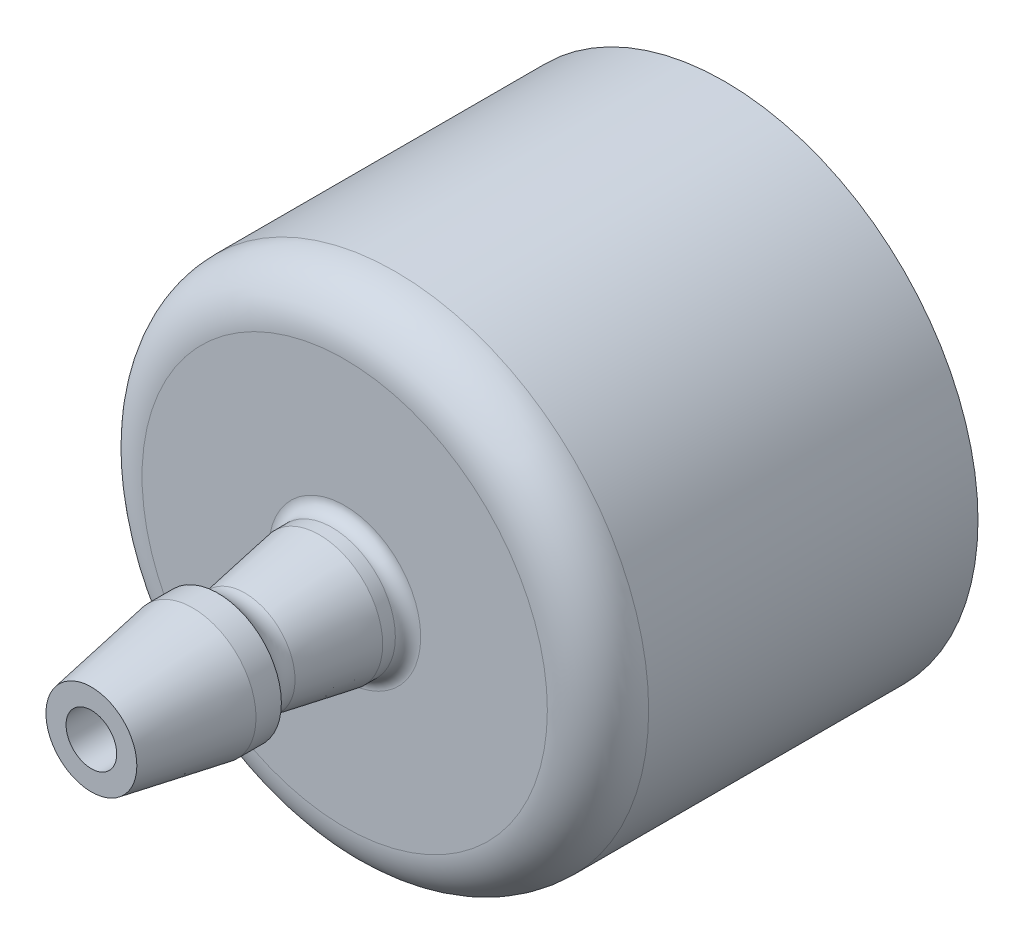
ISO-10303-21;
HEADER;
FILE_DESCRIPTION(('STEP AP214'),'2;1');
FILE_NAME('part.step','',(''),(''),'','','');
FILE_SCHEMA(('AUTOMOTIVE_DESIGN { 1 0 10303 214 1 1 1 1 }'));
ENDSEC;
DATA;
#1=APPLICATION_CONTEXT('core data for automotive mechanical design processes');
#2=APPLICATION_PROTOCOL_DEFINITION('international standard','automotive_design',2000,#1);
#3=PRODUCT_CONTEXT('',#1,'mechanical');
#4=PRODUCT('Part','Part','',(#3));
#5=PRODUCT_RELATED_PRODUCT_CATEGORY('part','',(#4));
#6=PRODUCT_DEFINITION_FORMATION('','',#4);
#7=PRODUCT_DEFINITION_CONTEXT('part definition',#1,'design');
#8=PRODUCT_DEFINITION('design','',#6,#7);
#9=PRODUCT_DEFINITION_SHAPE('','',#8);
#10=(LENGTH_UNIT() NAMED_UNIT(*) SI_UNIT(.MILLI.,.METRE.));
#11=(NAMED_UNIT(*) PLANE_ANGLE_UNIT() SI_UNIT($,.RADIAN.));
#12=(NAMED_UNIT(*) SI_UNIT($,.STERADIAN.) SOLID_ANGLE_UNIT());
#13=UNCERTAINTY_MEASURE_WITH_UNIT(LENGTH_MEASURE(1.E-05),#10,'distance_accuracy_value','');
#14=(GEOMETRIC_REPRESENTATION_CONTEXT(3) GLOBAL_UNCERTAINTY_ASSIGNED_CONTEXT((#13)) GLOBAL_UNIT_ASSIGNED_CONTEXT((#10,
#11,#12)) REPRESENTATION_CONTEXT('',''));
#15=CARTESIAN_POINT('',(0.,0.,0.));
#16=DIRECTION('',(0.,0.,1.));
#17=DIRECTION('',(1.,0.,0.));
#18=AXIS2_PLACEMENT_3D('',#15,#16,#17);
#19=CARTESIAN_POINT('',(0.,0.,5.));
#20=DIRECTION('',(0.,0.,-1.));
#21=DIRECTION('',(-1.,0.,0.));
#22=AXIS2_PLACEMENT_3D('',#19,#20,#21);
#23=CYLINDRICAL_SURFACE('',#22,2.5);
#24=CARTESIAN_POINT('',(0.,0.,0.5));
#25=DIRECTION('',(0.,0.,1.));
#26=DIRECTION('',(1.,0.,0.));
#27=AXIS2_PLACEMENT_3D('',#24,#25,#26);
#28=CIRCLE('',#27,2.5);
#29=CARTESIAN_POINT('',(2.5,0.,0.5));
#30=VERTEX_POINT('',#29);
#31=EDGE_CURVE('E45',#30,#30,#28,.T.);
#32=ORIENTED_EDGE('',*,*,#31,.T.);
#33=EDGE_LOOP('',(#32));
#34=FACE_BOUND('',#33,.T.);
#35=CARTESIAN_POINT('',(0.,0.,0.999999999999935));
#36=DIRECTION('',(0.,0.,1.));
#37=DIRECTION('',(1.,0.,0.));
#38=AXIS2_PLACEMENT_3D('',#35,#36,#37);
#39=CIRCLE('',#38,2.5);
#40=CARTESIAN_POINT('',(2.5,0.,0.999999999999935));
#41=VERTEX_POINT('',#40);
#42=EDGE_CURVE('E71',#41,#41,#39,.F.);
#43=ORIENTED_EDGE('',*,*,#42,.T.);
#44=EDGE_LOOP('',(#43));
#45=FACE_BOUND('',#44,.T.);
#46=ADVANCED_FACE('F30',(#34,#45),#23,.T.);
#47=CARTESIAN_POINT('',(0.,0.,5.));
#48=DIRECTION('',(0.,0.,-1.));
#49=DIRECTION('',(-1.,0.,0.));
#50=AXIS2_PLACEMENT_3D('',#47,#48,#49);
#51=CYLINDRICAL_SURFACE('',#50,1.);
#52=CARTESIAN_POINT('',(0.,0.,0.));
#53=DIRECTION('',(0.,0.,1.));
#54=DIRECTION('',(1.,0.,0.));
#55=AXIS2_PLACEMENT_3D('',#52,#53,#54);
#56=CIRCLE('',#55,1.);
#57=CARTESIAN_POINT('',(1.,0.,0.));
#58=VERTEX_POINT('',#57);
#59=EDGE_CURVE('E56',#58,#58,#56,.F.);
#60=ORIENTED_EDGE('',*,*,#59,.T.);
#61=EDGE_LOOP('',(#60));
#62=FACE_BOUND('',#61,.T.);
#63=CARTESIAN_POINT('',(0.,0.,10.));
#64=DIRECTION('',(0.,0.,1.));
#65=DIRECTION('',(1.,0.,0.));
#66=AXIS2_PLACEMENT_3D('',#63,#64,#65);
#67=CIRCLE('',#66,1.);
#68=CARTESIAN_POINT('',(1.,0.,10.));
#69=VERTEX_POINT('',#68);
#70=EDGE_CURVE('E77',#69,#69,#67,.T.);
#71=ORIENTED_EDGE('',*,*,#70,.T.);
#72=EDGE_LOOP('',(#71));
#73=FACE_BOUND('',#72,.T.);
#74=ADVANCED_FACE('F105',(#62,#73),#51,.F.);
#75=CARTESIAN_POINT('',(0.,0.,5.));
#76=DIRECTION('',(0.,0.,-1.));
#77=DIRECTION('',(-1.,0.,0.));
#78=AXIS2_PLACEMENT_3D('',#75,#76,#77);
#79=CONICAL_SURFACE('',#78,1.79469207716614,0.17453292519943);
#80=CARTESIAN_POINT('',(0.,0.,3.94162981419659));
#81=DIRECTION('',(0.,0.,-1.));
#82=DIRECTION('',(-1.,0.,0.));
#83=AXIS2_PLACEMENT_3D('',#80,#81,#82);
#84=CIRCLE('',#83,1.98131129650071);
#85=CARTESIAN_POINT('',(-1.98131129650071,0.,3.94162981419659));
#86=VERTEX_POINT('',#85);
#87=EDGE_CURVE('E62',#86,#86,#84,.T.);
#88=ORIENTED_EDGE('',*,*,#87,.T.);
#89=EDGE_LOOP('',(#88));
#90=FACE_BOUND('',#89,.T.);
#91=ORIENTED_EDGE('',*,*,#42,.F.);
#92=EDGE_LOOP('',(#91));
#93=FACE_BOUND('',#92,.T.);
#94=ADVANCED_FACE('F113',(#90,#93),#79,.T.);
#95=CARTESIAN_POINT('',(0.,0.,10.));
#96=DIRECTION('',(0.,0.,1.));
#97=DIRECTION('',(1.,0.,0.));
#98=AXIS2_PLACEMENT_3D('',#95,#96,#97);
#99=PLANE('',#98);
#100=CARTESIAN_POINT('',(0.,0.,10.));
#101=DIRECTION('',(0.,0.,1.));
#102=DIRECTION('',(1.,0.,0.));
#103=AXIS2_PLACEMENT_3D('',#100,#101,#102);
#104=CIRCLE('',#103,1.79469207716614);
#105=CARTESIAN_POINT('',(1.79469207716614,0.,10.));
#106=VERTEX_POINT('',#105);
#107=EDGE_CURVE('E68',#106,#106,#104,.T.);
#108=ORIENTED_EDGE('',*,*,#107,.T.);
#109=EDGE_LOOP('',(#108));
#110=FACE_BOUND('',#109,.T.);
#111=ORIENTED_EDGE('',*,*,#70,.F.);
#112=EDGE_LOOP('',(#111));
#113=FACE_BOUND('',#112,.T.);
#114=ADVANCED_FACE('F121',(#110,#113),#99,.T.);
#115=CARTESIAN_POINT('',(0.,0.,10.));
#116=DIRECTION('',(0.,0.,-1.));
#117=DIRECTION('',(-1.,0.,0.));
#118=AXIS2_PLACEMENT_3D('',#115,#116,#117);
#119=CYLINDRICAL_SURFACE('',#118,2.5);
#120=CARTESIAN_POINT('',(0.,0.,5.99999999999994));
#121=DIRECTION('',(0.,0.,1.));
#122=DIRECTION('',(1.,0.,0.));
#123=AXIS2_PLACEMENT_3D('',#120,#121,#122);
#124=CIRCLE('',#123,2.5);
#125=CARTESIAN_POINT('',(2.5,0.,5.99999999999994));
#126=VERTEX_POINT('',#125);
#127=EDGE_CURVE('E65',#126,#126,#124,.F.);
#128=ORIENTED_EDGE('',*,*,#127,.T.);
#129=EDGE_LOOP('',(#128));
#130=FACE_BOUND('',#129,.T.);
#131=CARTESIAN_POINT('',(0.,0.,5.));
#132=DIRECTION('',(0.,0.,1.));
#133=DIRECTION('',(1.,0.,0.));
#134=AXIS2_PLACEMENT_3D('',#131,#132,#133);
#135=CIRCLE('',#134,2.5);
#136=CARTESIAN_POINT('',(2.5,0.,5.));
#137=VERTEX_POINT('',#136);
#138=EDGE_CURVE('E74',#137,#137,#135,.T.);
#139=ORIENTED_EDGE('',*,*,#138,.T.);
#140=EDGE_LOOP('',(#139));
#141=FACE_BOUND('',#140,.T.);
#142=ADVANCED_FACE('F127',(#130,#141),#119,.T.);
#143=CARTESIAN_POINT('',(0.,0.,10.));
#144=DIRECTION('',(0.,0.,-1.));
#145=DIRECTION('',(-1.,0.,0.));
#146=AXIS2_PLACEMENT_3D('',#143,#144,#145);
#147=CONICAL_SURFACE('',#146,1.79469207716614,0.17453292519943);
#148=ORIENTED_EDGE('',*,*,#127,.F.);
#149=EDGE_LOOP('',(#148));
#150=FACE_BOUND('',#149,.T.);
#151=ORIENTED_EDGE('',*,*,#107,.F.);
#152=EDGE_LOOP('',(#151));
#153=FACE_BOUND('',#152,.T.);
#154=ADVANCED_FACE('F123',(#150,#153),#147,.T.);
#155=CARTESIAN_POINT('',(0.,0.,4.11527799186352));
#156=DIRECTION('',(0.,0.,1.));
#157=DIRECTION('',(1.,0.,0.));
#158=AXIS2_PLACEMENT_3D('',#155,#156,#157);
#159=TOROIDAL_SURFACE('',#158,2.96611904951292,1.);
#160=ORIENTED_EDGE('',*,*,#87,.F.);
#161=EDGE_LOOP('',(#160));
#162=FACE_BOUND('',#161,.T.);
#163=ORIENTED_EDGE('',*,*,#138,.F.);
#164=EDGE_LOOP('',(#163));
#165=FACE_BOUND('',#164,.T.);
#166=ADVANCED_FACE('F126',(#162,#165),#159,.F.);
#167=CARTESIAN_POINT('',(0.,0.,-15.));
#168=DIRECTION('',(0.,0.,1.));
#169=DIRECTION('',(1.,0.,0.));
#170=AXIS2_PLACEMENT_3D('',#167,#168,#169);
#171=CYLINDRICAL_SURFACE('',#170,10.);
#172=CARTESIAN_POINT('',(0.,0.,-2.));
#173=DIRECTION('',(0.,0.,1.));
#174=DIRECTION('',(1.,0.,0.));
#175=AXIS2_PLACEMENT_3D('',#172,#173,#174);
#176=CIRCLE('',#175,10.);
#177=CARTESIAN_POINT('',(10.,0.,-2.));
#178=VERTEX_POINT('',#177);
#179=EDGE_CURVE('E50',#178,#178,#176,.F.);
#180=ORIENTED_EDGE('',*,*,#179,.T.);
#181=EDGE_LOOP('',(#180));
#182=FACE_BOUND('',#181,.T.);
#183=CARTESIAN_POINT('',(0.,0.,-15.));
#184=DIRECTION('',(0.,0.,1.));
#185=DIRECTION('',(1.,0.,0.));
#186=AXIS2_PLACEMENT_3D('',#183,#184,#185);
#187=CIRCLE('',#186,10.);
#188=CARTESIAN_POINT('',(10.,0.,-15.));
#189=VERTEX_POINT('',#188);
#190=EDGE_CURVE('E80',#189,#189,#187,.T.);
#191=ORIENTED_EDGE('',*,*,#190,.T.);
#192=EDGE_LOOP('',(#191));
#193=FACE_BOUND('',#192,.T.);
#194=ADVANCED_FACE('F130',(#182,#193),#171,.T.);
#195=CARTESIAN_POINT('',(0.,0.,-15.));
#196=DIRECTION('',(0.,0.,1.));
#197=DIRECTION('',(1.,0.,0.));
#198=AXIS2_PLACEMENT_3D('',#195,#196,#197);
#199=PLANE('',#198);
#200=CARTESIAN_POINT('',(0.,0.,-15.));
#201=DIRECTION('',(0.,0.,1.));
#202=DIRECTION('',(1.,0.,0.));
#203=AXIS2_PLACEMENT_3D('',#200,#201,#202);
#204=CIRCLE('',#203,8.5);
#205=CARTESIAN_POINT('',(8.5,0.,-15.));
#206=VERTEX_POINT('',#205);
#207=EDGE_CURVE('E37',#206,#206,#204,.T.);
#208=ORIENTED_EDGE('',*,*,#207,.T.);
#209=EDGE_LOOP('',(#208));
#210=FACE_BOUND('',#209,.T.);
#211=ORIENTED_EDGE('',*,*,#190,.F.);
#212=EDGE_LOOP('',(#211));
#213=FACE_BOUND('',#212,.T.);
#214=ADVANCED_FACE('F147',(#210,#213),#199,.F.);
#215=CARTESIAN_POINT('',(0.,0.,0.));
#216=DIRECTION('',(0.,0.,1.));
#217=DIRECTION('',(1.,0.,0.));
#218=AXIS2_PLACEMENT_3D('',#215,#216,#217);
#219=PLANE('',#218);
#220=CARTESIAN_POINT('',(0.,0.,0.));
#221=DIRECTION('',(0.,0.,1.));
#222=DIRECTION('',(1.,0.,0.));
#223=AXIS2_PLACEMENT_3D('',#220,#221,#222);
#224=CIRCLE('',#223,3.);
#225=CARTESIAN_POINT('',(3.,0.,0.));
#226=VERTEX_POINT('',#225);
#227=EDGE_CURVE('E41',#226,#226,#224,.F.);
#228=ORIENTED_EDGE('',*,*,#227,.T.);
#229=EDGE_LOOP('',(#228));
#230=FACE_BOUND('',#229,.T.);
#231=CARTESIAN_POINT('',(0.,0.,0.));
#232=DIRECTION('',(0.,0.,1.));
#233=DIRECTION('',(1.,0.,0.));
#234=AXIS2_PLACEMENT_3D('',#231,#232,#233);
#235=CIRCLE('',#234,8.);
#236=CARTESIAN_POINT('',(8.,0.,0.));
#237=VERTEX_POINT('',#236);
#238=EDGE_CURVE('E53',#237,#237,#235,.T.);
#239=ORIENTED_EDGE('',*,*,#238,.T.);
#240=EDGE_LOOP('',(#239));
#241=FACE_BOUND('',#240,.T.);
#242=ADVANCED_FACE('F102',(#230,#241),#219,.T.);
#243=CARTESIAN_POINT('',(0.,0.,-17.));
#244=DIRECTION('',(0.,0.,1.));
#245=DIRECTION('',(1.,0.,0.));
#246=AXIS2_PLACEMENT_3D('',#243,#244,#245);
#247=CYLINDRICAL_SURFACE('',#246,8.);
#248=CARTESIAN_POINT('',(0.,0.,-14.5));
#249=DIRECTION('',(0.,0.,1.));
#250=DIRECTION('',(1.,0.,0.));
#251=AXIS2_PLACEMENT_3D('',#248,#249,#250);
#252=CIRCLE('',#251,8.);
#253=CARTESIAN_POINT('',(8.,0.,-14.5));
#254=VERTEX_POINT('',#253);
#255=EDGE_CURVE('E10',#254,#254,#252,.F.);
#256=ORIENTED_EDGE('',*,*,#255,.T.);
#257=EDGE_LOOP('',(#256));
#258=FACE_BOUND('',#257,.T.);
#259=CARTESIAN_POINT('',(0.,0.,-2.));
#260=DIRECTION('',(0.,0.,1.));
#261=DIRECTION('',(1.,0.,0.));
#262=AXIS2_PLACEMENT_3D('',#259,#260,#261);
#263=CIRCLE('',#262,8.);
#264=CARTESIAN_POINT('',(8.,0.,-2.));
#265=VERTEX_POINT('',#264);
#266=EDGE_CURVE('E83',#265,#265,#263,.T.);
#267=ORIENTED_EDGE('',*,*,#266,.T.);
#268=EDGE_LOOP('',(#267));
#269=FACE_BOUND('',#268,.T.);
#270=ADVANCED_FACE('F87',(#258,#269),#247,.F.);
#271=CARTESIAN_POINT('',(0.,0.,-2.));
#272=DIRECTION('',(0.,0.,1.));
#273=DIRECTION('',(1.,0.,0.));
#274=AXIS2_PLACEMENT_3D('',#271,#272,#273);
#275=PLANE('',#274);
#276=CARTESIAN_POINT('',(0.,0.,-2.));
#277=DIRECTION('',(0.,0.,1.));
#278=DIRECTION('',(1.,0.,0.));
#279=AXIS2_PLACEMENT_3D('',#276,#277,#278);
#280=CIRCLE('',#279,3.);
#281=CARTESIAN_POINT('',(3.,0.,-2.));
#282=VERTEX_POINT('',#281);
#283=EDGE_CURVE('E59',#282,#282,#280,.T.);
#284=ORIENTED_EDGE('',*,*,#283,.T.);
#285=EDGE_LOOP('',(#284));
#286=FACE_BOUND('',#285,.T.);
#287=ORIENTED_EDGE('',*,*,#266,.F.);
#288=EDGE_LOOP('',(#287));
#289=FACE_BOUND('',#288,.T.);
#290=ADVANCED_FACE('F89',(#286,#289),#275,.F.);
#291=CARTESIAN_POINT('',(0.,0.,0.));
#292=DIRECTION('',(0.,0.,1.));
#293=DIRECTION('',(1.,0.,0.));
#294=AXIS2_PLACEMENT_3D('',#291,#292,#293);
#295=TOROIDAL_SURFACE('',#294,3.,2.);
#296=ORIENTED_EDGE('',*,*,#59,.F.);
#297=EDGE_LOOP('',(#296));
#298=FACE_BOUND('',#297,.T.);
#299=ORIENTED_EDGE('',*,*,#283,.F.);
#300=EDGE_LOOP('',(#299));
#301=FACE_BOUND('',#300,.T.);
#302=ADVANCED_FACE('F91',(#298,#301),#295,.T.);
#303=CARTESIAN_POINT('',(0.,0.,-2.));
#304=DIRECTION('',(0.,0.,1.));
#305=DIRECTION('',(1.,0.,0.));
#306=AXIS2_PLACEMENT_3D('',#303,#304,#305);
#307=TOROIDAL_SURFACE('',#306,8.,2.);
#308=ORIENTED_EDGE('',*,*,#179,.F.);
#309=EDGE_LOOP('',(#308));
#310=FACE_BOUND('',#309,.T.);
#311=ORIENTED_EDGE('',*,*,#238,.F.);
#312=EDGE_LOOP('',(#311));
#313=FACE_BOUND('',#312,.T.);
#314=ADVANCED_FACE('F98',(#310,#313),#307,.T.);
#315=CARTESIAN_POINT('',(0.,0.,0.5));
#316=DIRECTION('',(0.,0.,1.));
#317=DIRECTION('',(1.,0.,0.));
#318=AXIS2_PLACEMENT_3D('',#315,#316,#317);
#319=TOROIDAL_SURFACE('',#318,3.,0.5);
#320=ORIENTED_EDGE('',*,*,#227,.F.);
#321=EDGE_LOOP('',(#320));
#322=FACE_BOUND('',#321,.T.);
#323=ORIENTED_EDGE('',*,*,#31,.F.);
#324=EDGE_LOOP('',(#323));
#325=FACE_BOUND('',#324,.T.);
#326=ADVANCED_FACE('F134',(#322,#325),#319,.F.);
#327=CARTESIAN_POINT('',(0.,0.,-14.5));
#328=DIRECTION('',(0.,0.,1.));
#329=DIRECTION('',(1.,0.,0.));
#330=AXIS2_PLACEMENT_3D('',#327,#328,#329);
#331=TOROIDAL_SURFACE('',#330,8.5,0.5);
#332=ORIENTED_EDGE('',*,*,#255,.F.);
#333=EDGE_LOOP('',(#332));
#334=FACE_BOUND('',#333,.T.);
#335=ORIENTED_EDGE('',*,*,#207,.F.);
#336=EDGE_LOOP('',(#335));
#337=FACE_BOUND('',#336,.T.);
#338=ADVANCED_FACE('F32',(#334,#337),#331,.T.);
#339=CLOSED_SHELL('',(#46,#74,#94,#114,#142,#154,#166,#194,#214,#242,#270,#290,#302,#314,#326,#338));
#340=MANIFOLD_SOLID_BREP('B2',#339);
#341=ADVANCED_BREP_SHAPE_REPRESENTATION('',(#18,#340),#14);
#342=SHAPE_DEFINITION_REPRESENTATION(#9,#341);
ENDSEC;
END-ISO-10303-21;
